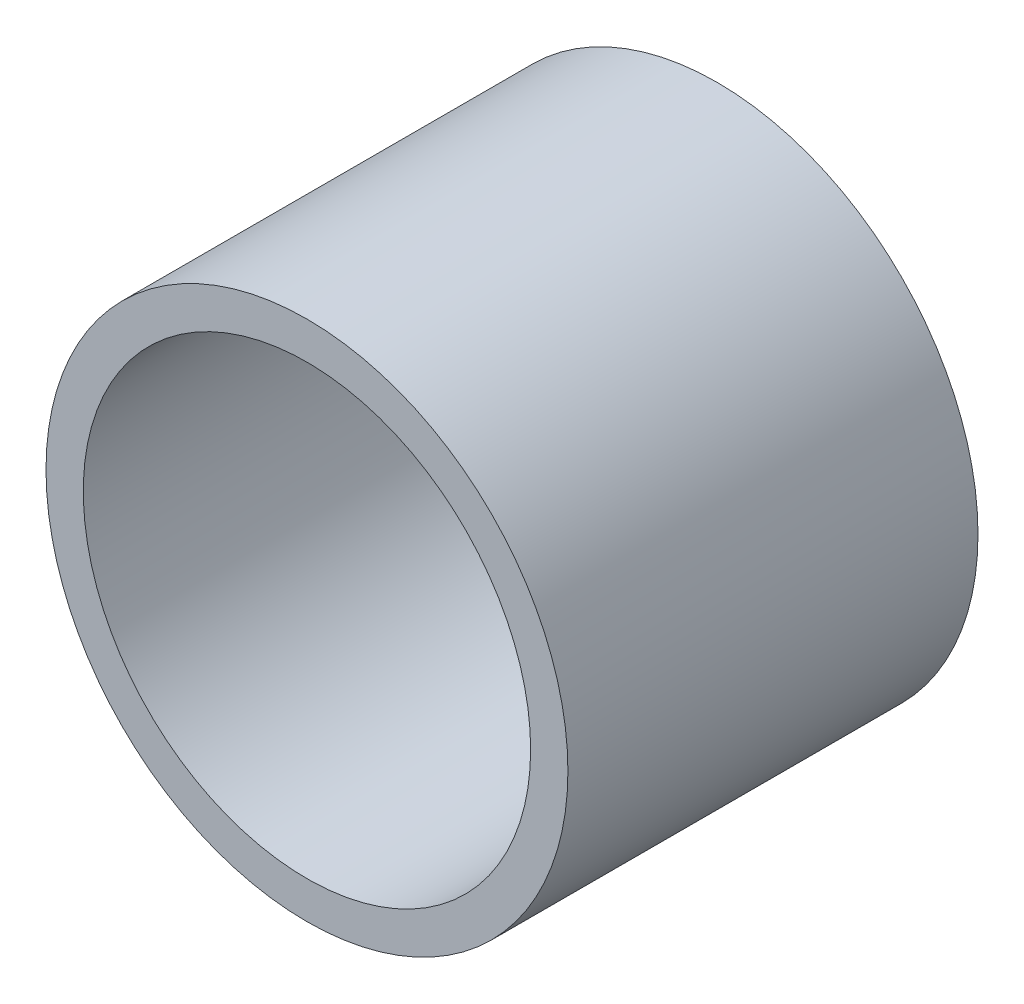
ISO-10303-21;
HEADER;
FILE_DESCRIPTION(('STEP AP214'),'2;1');
FILE_NAME('part.step','',(''),(''),'','','');
FILE_SCHEMA(('AUTOMOTIVE_DESIGN { 1 0 10303 214 1 1 1 1 }'));
ENDSEC;
DATA;
#1=APPLICATION_CONTEXT('core data for automotive mechanical design processes');
#2=APPLICATION_PROTOCOL_DEFINITION('international standard','automotive_design',2000,#1);
#3=PRODUCT_CONTEXT('',#1,'mechanical');
#4=PRODUCT('Part','Part','',(#3));
#5=PRODUCT_RELATED_PRODUCT_CATEGORY('part','',(#4));
#6=PRODUCT_DEFINITION_FORMATION('','',#4);
#7=PRODUCT_DEFINITION_CONTEXT('part definition',#1,'design');
#8=PRODUCT_DEFINITION('design','',#6,#7);
#9=PRODUCT_DEFINITION_SHAPE('','',#8);
#10=(LENGTH_UNIT() NAMED_UNIT(*) SI_UNIT(.MILLI.,.METRE.));
#11=(NAMED_UNIT(*) PLANE_ANGLE_UNIT() SI_UNIT($,.RADIAN.));
#12=(NAMED_UNIT(*) SI_UNIT($,.STERADIAN.) SOLID_ANGLE_UNIT());
#13=UNCERTAINTY_MEASURE_WITH_UNIT(LENGTH_MEASURE(1.E-05),#10,'distance_accuracy_value','');
#14=(GEOMETRIC_REPRESENTATION_CONTEXT(3) GLOBAL_UNCERTAINTY_ASSIGNED_CONTEXT((#13)) GLOBAL_UNIT_ASSIGNED_CONTEXT((#10,
#11,#12)) REPRESENTATION_CONTEXT('',''));
#15=CARTESIAN_POINT('',(0.,0.,0.));
#16=DIRECTION('',(0.,0.,1.));
#17=DIRECTION('',(1.,0.,0.));
#18=AXIS2_PLACEMENT_3D('',#15,#16,#17);
#19=CARTESIAN_POINT('',(0.,0.,27.5));
#20=DIRECTION('',(0.,0.,-1.));
#21=DIRECTION('',(-1.,0.,0.));
#22=AXIS2_PLACEMENT_3D('',#19,#20,#21);
#23=CYLINDRICAL_SURFACE('',#22,35.);
#24=CARTESIAN_POINT('',(0.,0.,27.5));
#25=DIRECTION('',(0.,0.,1.));
#26=DIRECTION('',(1.,0.,0.));
#27=AXIS2_PLACEMENT_3D('',#24,#25,#26);
#28=CIRCLE('',#27,35.);
#29=CARTESIAN_POINT('',(35.,0.,27.5));
#30=VERTEX_POINT('',#29);
#31=EDGE_CURVE('E10',#30,#30,#28,.T.);
#32=ORIENTED_EDGE('',*,*,#31,.F.);
#33=EDGE_LOOP('',(#32));
#34=FACE_BOUND('',#33,.T.);
#35=CARTESIAN_POINT('',(0.,0.,-27.5));
#36=DIRECTION('',(0.,0.,1.));
#37=DIRECTION('',(1.,0.,0.));
#38=AXIS2_PLACEMENT_3D('',#35,#36,#37);
#39=CIRCLE('',#38,35.);
#40=CARTESIAN_POINT('',(35.,0.,-27.5));
#41=VERTEX_POINT('',#40);
#42=EDGE_CURVE('E40',#41,#41,#39,.T.);
#43=ORIENTED_EDGE('',*,*,#42,.T.);
#44=EDGE_LOOP('',(#43));
#45=FACE_BOUND('',#44,.T.);
#46=ADVANCED_FACE('F37',(#34,#45),#23,.T.);
#47=CARTESIAN_POINT('',(0.,0.,27.5));
#48=DIRECTION('',(0.,0.,1.));
#49=DIRECTION('',(1.,0.,0.));
#50=AXIS2_PLACEMENT_3D('',#47,#48,#49);
#51=PLANE('',#50);
#52=CARTESIAN_POINT('',(0.,0.,27.5));
#53=DIRECTION('',(0.,0.,1.));
#54=DIRECTION('',(1.,0.,0.));
#55=AXIS2_PLACEMENT_3D('',#52,#53,#54);
#56=CIRCLE('',#55,30.);
#57=CARTESIAN_POINT('',(30.,0.,27.5));
#58=VERTEX_POINT('',#57);
#59=EDGE_CURVE('E51',#58,#58,#56,.T.);
#60=ORIENTED_EDGE('',*,*,#59,.F.);
#61=EDGE_LOOP('',(#60));
#62=FACE_BOUND('',#61,.T.);
#63=ORIENTED_EDGE('',*,*,#31,.T.);
#64=EDGE_LOOP('',(#63));
#65=FACE_BOUND('',#64,.T.);
#66=ADVANCED_FACE('F68',(#62,#65),#51,.T.);
#67=CARTESIAN_POINT('',(0.,0.,-27.5));
#68=DIRECTION('',(0.,0.,1.));
#69=DIRECTION('',(1.,0.,0.));
#70=AXIS2_PLACEMENT_3D('',#67,#68,#69);
#71=PLANE('',#70);
#72=CARTESIAN_POINT('',(0.,0.,-27.5));
#73=DIRECTION('',(0.,0.,1.));
#74=DIRECTION('',(1.,0.,0.));
#75=AXIS2_PLACEMENT_3D('',#72,#73,#74);
#76=CIRCLE('',#75,30.);
#77=CARTESIAN_POINT('',(30.,0.,-27.5));
#78=VERTEX_POINT('',#77);
#79=EDGE_CURVE('E49',#78,#78,#76,.T.);
#80=ORIENTED_EDGE('',*,*,#79,.T.);
#81=EDGE_LOOP('',(#80));
#82=FACE_BOUND('',#81,.T.);
#83=ORIENTED_EDGE('',*,*,#42,.F.);
#84=EDGE_LOOP('',(#83));
#85=FACE_BOUND('',#84,.T.);
#86=ADVANCED_FACE('F59',(#82,#85),#71,.F.);
#87=CARTESIAN_POINT('',(0.,0.,-27.5));
#88=DIRECTION('',(0.,0.,1.));
#89=DIRECTION('',(1.,0.,0.));
#90=AXIS2_PLACEMENT_3D('',#87,#88,#89);
#91=CYLINDRICAL_SURFACE('',#90,30.);
#92=ORIENTED_EDGE('',*,*,#79,.F.);
#93=EDGE_LOOP('',(#92));
#94=FACE_BOUND('',#93,.T.);
#95=ORIENTED_EDGE('',*,*,#59,.T.);
#96=EDGE_LOOP('',(#95));
#97=FACE_BOUND('',#96,.T.);
#98=ADVANCED_FACE('F62',(#94,#97),#91,.F.);
#99=CLOSED_SHELL('',(#46,#66,#86,#98));
#100=MANIFOLD_SOLID_BREP('B2',#99);
#101=ADVANCED_BREP_SHAPE_REPRESENTATION('',(#18,#100),#14);
#102=SHAPE_DEFINITION_REPRESENTATION(#9,#101);
ENDSEC;
END-ISO-10303-21;
